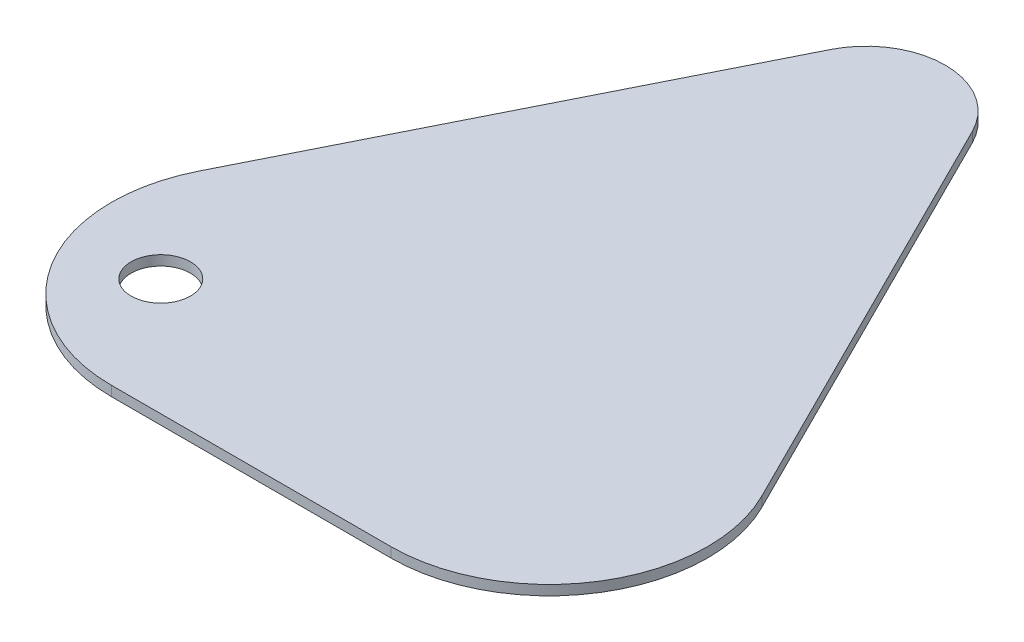
ISO-10303-21;
HEADER;
FILE_DESCRIPTION(('STEP AP214'),'2;1');
FILE_NAME('part.step','',(''),(''),'','','');
FILE_SCHEMA(('AUTOMOTIVE_DESIGN { 1 0 10303 214 1 1 1 1 }'));
ENDSEC;
DATA;
#1=APPLICATION_CONTEXT('core data for automotive mechanical design processes');
#2=APPLICATION_PROTOCOL_DEFINITION('international standard','automotive_design',2000,#1);
#3=PRODUCT_CONTEXT('',#1,'mechanical');
#4=PRODUCT('Part','Part','',(#3));
#5=PRODUCT_RELATED_PRODUCT_CATEGORY('part','',(#4));
#6=PRODUCT_DEFINITION_FORMATION('','',#4);
#7=PRODUCT_DEFINITION_CONTEXT('part definition',#1,'design');
#8=PRODUCT_DEFINITION('design','',#6,#7);
#9=PRODUCT_DEFINITION_SHAPE('','',#8);
#10=(LENGTH_UNIT() NAMED_UNIT(*) SI_UNIT(.MILLI.,.METRE.));
#11=(NAMED_UNIT(*) PLANE_ANGLE_UNIT() SI_UNIT($,.RADIAN.));
#12=(NAMED_UNIT(*) SI_UNIT($,.STERADIAN.) SOLID_ANGLE_UNIT());
#13=UNCERTAINTY_MEASURE_WITH_UNIT(LENGTH_MEASURE(1.E-05),#10,'distance_accuracy_value','');
#14=(GEOMETRIC_REPRESENTATION_CONTEXT(3) GLOBAL_UNCERTAINTY_ASSIGNED_CONTEXT((#13)) GLOBAL_UNIT_ASSIGNED_CONTEXT((#10,
#11,#12)) REPRESENTATION_CONTEXT('',''));
#15=CARTESIAN_POINT('',(0.,0.,0.));
#16=DIRECTION('',(0.,0.,1.));
#17=DIRECTION('',(1.,0.,0.));
#18=AXIS2_PLACEMENT_3D('',#15,#16,#17);
#19=CARTESIAN_POINT('',(-7.05572809000084,0.25,-8.));
#20=DIRECTION('',(0.,-1.,0.));
#21=DIRECTION('',(0.,0.,-1.));
#22=AXIS2_PLACEMENT_3D('',#19,#20,#21);
#23=PLANE('',#22);
#24=DIRECTION('',(1.,0.,0.));
#25=VECTOR('',#24,1.);
#26=CARTESIAN_POINT('',(0.,0.25,0.));
#27=LINE('',#26,#25);
#28=CARTESIAN_POINT('',(-7.05572809000074,0.25,0.));
#29=VERTEX_POINT('',#28);
#30=CARTESIAN_POINT('',(7.05572809000074,0.25,0.));
#31=VERTEX_POINT('',#30);
#32=EDGE_CURVE('E96',#29,#31,#27,.T.);
#33=ORIENTED_EDGE('',*,*,#32,.T.);
#34=CARTESIAN_POINT('',(7.05572809000084,0.25,-8.));
#35=DIRECTION('',(0.,1.,0.));
#36=DIRECTION('',(0.,0.,1.));
#37=AXIS2_PLACEMENT_3D('',#34,#35,#36);
#38=CIRCLE('',#37,8.);
#39=CARTESIAN_POINT('',(14.2111456180001,0.25,-11.5777087639998));
#40=VERTEX_POINT('',#39);
#41=EDGE_CURVE('E153',#31,#40,#38,.T.);
#42=ORIENTED_EDGE('',*,*,#41,.T.);
#43=DIRECTION('',(-0.447213595499958,0.,-0.894427190999916));
#44=VECTOR('',#43,1.);
#45=CARTESIAN_POINT('',(14.2111456180001,0.25,-11.5777087639998));
#46=LINE('',#45,#44);
#47=CARTESIAN_POINT('',(3.57770876399969,0.25,-32.8445824720006));
#48=VERTEX_POINT('',#47);
#49=EDGE_CURVE('E110',#40,#48,#46,.T.);
#50=ORIENTED_EDGE('',*,*,#49,.T.);
#51=CARTESIAN_POINT('',(0.,0.25,-31.0557280900008));
#52=DIRECTION('',(0.,1.,0.));
#53=DIRECTION('',(0.,0.,1.));
#54=AXIS2_PLACEMENT_3D('',#51,#52,#53);
#55=CIRCLE('',#54,4.);
#56=CARTESIAN_POINT('',(-3.57770876399969,0.25,-32.8445824720006));
#57=VERTEX_POINT('',#56);
#58=EDGE_CURVE('E104',#48,#57,#55,.T.);
#59=ORIENTED_EDGE('',*,*,#58,.T.);
#60=DIRECTION('',(-0.447213595499958,0.,0.894427190999916));
#61=VECTOR('',#60,1.);
#62=CARTESIAN_POINT('',(-14.2111456180001,0.25,-11.5777087639998));
#63=LINE('',#62,#61);
#64=CARTESIAN_POINT('',(-14.2111456180001,0.25,-11.5777087639998));
#65=VERTEX_POINT('',#64);
#66=EDGE_CURVE('E108',#57,#65,#63,.T.);
#67=ORIENTED_EDGE('',*,*,#66,.T.);
#68=CARTESIAN_POINT('',(-7.05572809000084,0.25,-8.));
#69=DIRECTION('',(0.,1.,0.));
#70=DIRECTION('',(0.,0.,-1.));
#71=AXIS2_PLACEMENT_3D('',#68,#69,#70);
#72=CIRCLE('',#71,8.);
#73=EDGE_CURVE('E60',#65,#29,#72,.T.);
#74=ORIENTED_EDGE('',*,*,#73,.T.);
#75=EDGE_LOOP('',(#33,#42,#50,#59,#67,#74));
#76=FACE_BOUND('',#75,.T.);
#77=CARTESIAN_POINT('',(-10.458331323409,0.25,-5.89707555152346));
#78=DIRECTION('',(0.,1.,0.));
#79=DIRECTION('',(0.,0.,1.));
#80=AXIS2_PLACEMENT_3D('',#77,#78,#79);
#81=CIRCLE('',#80,1.5);
#82=CARTESIAN_POINT('',(-10.458331323409,0.25,-4.39707555152346));
#83=VERTEX_POINT('',#82);
#84=EDGE_CURVE('E130',#83,#83,#81,.T.);
#85=ORIENTED_EDGE('',*,*,#84,.F.);
#86=EDGE_LOOP('',(#85));
#87=FACE_BOUND('',#86,.T.);
#88=ADVANCED_FACE('F43',(#76,#87),#23,.F.);
#89=CARTESIAN_POINT('',(-7.05572809000084,-0.25,-8.));
#90=DIRECTION('',(0.,-1.,0.));
#91=DIRECTION('',(0.,0.,-1.));
#92=AXIS2_PLACEMENT_3D('',#89,#90,#91);
#93=PLANE('',#92);
#94=DIRECTION('',(1.,0.,0.));
#95=VECTOR('',#94,1.);
#96=CARTESIAN_POINT('',(0.,-0.25,0.));
#97=LINE('',#96,#95);
#98=CARTESIAN_POINT('',(-7.05572809000074,-0.25,0.));
#99=VERTEX_POINT('',#98);
#100=CARTESIAN_POINT('',(7.05572809000074,-0.25,0.));
#101=VERTEX_POINT('',#100);
#102=EDGE_CURVE('E90',#99,#101,#97,.T.);
#103=ORIENTED_EDGE('',*,*,#102,.F.);
#104=CARTESIAN_POINT('',(-7.05572809000084,-0.25,-8.));
#105=DIRECTION('',(0.,1.,0.));
#106=DIRECTION('',(0.,0.,-1.));
#107=AXIS2_PLACEMENT_3D('',#104,#105,#106);
#108=CIRCLE('',#107,8.);
#109=CARTESIAN_POINT('',(-14.2111456180001,-0.25,-11.5777087639998));
#110=VERTEX_POINT('',#109);
#111=EDGE_CURVE('E136',#110,#99,#108,.T.);
#112=ORIENTED_EDGE('',*,*,#111,.F.);
#113=DIRECTION('',(-0.447213595499958,0.,0.894427190999916));
#114=VECTOR('',#113,1.);
#115=CARTESIAN_POINT('',(-14.2111456180001,-0.25,-11.5777087639998));
#116=LINE('',#115,#114);
#117=CARTESIAN_POINT('',(-3.57770876399969,-0.25,-32.8445824720006));
#118=VERTEX_POINT('',#117);
#119=EDGE_CURVE('E83',#118,#110,#116,.T.);
#120=ORIENTED_EDGE('',*,*,#119,.F.);
#121=CARTESIAN_POINT('',(0.,-0.25,-31.0557280900008));
#122=DIRECTION('',(0.,1.,0.));
#123=DIRECTION('',(0.,0.,1.));
#124=AXIS2_PLACEMENT_3D('',#121,#122,#123);
#125=CIRCLE('',#124,4.);
#126=CARTESIAN_POINT('',(3.57770876399969,-0.25,-32.8445824720006));
#127=VERTEX_POINT('',#126);
#128=EDGE_CURVE('E118',#127,#118,#125,.T.);
#129=ORIENTED_EDGE('',*,*,#128,.F.);
#130=DIRECTION('',(-0.447213595499958,0.,-0.894427190999916));
#131=VECTOR('',#130,1.);
#132=CARTESIAN_POINT('',(14.2111456180001,-0.25,-11.5777087639998));
#133=LINE('',#132,#131);
#134=CARTESIAN_POINT('',(14.2111456180001,-0.25,-11.5777087639998));
#135=VERTEX_POINT('',#134);
#136=EDGE_CURVE('E132',#135,#127,#133,.T.);
#137=ORIENTED_EDGE('',*,*,#136,.F.);
#138=CARTESIAN_POINT('',(7.05572809000084,-0.25,-8.));
#139=DIRECTION('',(0.,1.,0.));
#140=DIRECTION('',(0.,0.,1.));
#141=AXIS2_PLACEMENT_3D('',#138,#139,#140);
#142=CIRCLE('',#141,8.);
#143=EDGE_CURVE('E129',#101,#135,#142,.T.);
#144=ORIENTED_EDGE('',*,*,#143,.F.);
#145=EDGE_LOOP('',(#103,#112,#120,#129,#137,#144));
#146=FACE_BOUND('',#145,.T.);
#147=CARTESIAN_POINT('',(-10.458331323409,-0.25,-5.89707555152346));
#148=DIRECTION('',(0.,1.,0.));
#149=DIRECTION('',(0.,0.,1.));
#150=AXIS2_PLACEMENT_3D('',#147,#148,#149);
#151=CIRCLE('',#150,1.5);
#152=CARTESIAN_POINT('',(-10.458331323409,-0.25,-4.39707555152346));
#153=VERTEX_POINT('',#152);
#154=EDGE_CURVE('E157',#153,#153,#151,.T.);
#155=ORIENTED_EDGE('',*,*,#154,.T.);
#156=EDGE_LOOP('',(#155));
#157=FACE_BOUND('',#156,.T.);
#158=ADVANCED_FACE('F148',(#146,#157),#93,.T.);
#159=CARTESIAN_POINT('',(0.,0.25,0.));
#160=DIRECTION('',(0.,0.,-1.));
#161=DIRECTION('',(-1.,0.,0.));
#162=AXIS2_PLACEMENT_3D('',#159,#160,#161);
#163=PLANE('',#162);
#164=ORIENTED_EDGE('',*,*,#102,.T.);
#165=DIRECTION('',(0.,-1.,0.));
#166=VECTOR('',#165,1.);
#167=CARTESIAN_POINT('',(7.05572809000074,0.25,0.));
#168=LINE('',#167,#166);
#169=EDGE_CURVE('E13',#31,#101,#168,.T.);
#170=ORIENTED_EDGE('',*,*,#169,.F.);
#171=ORIENTED_EDGE('',*,*,#32,.F.);
#172=DIRECTION('',(0.,-1.,0.));
#173=VECTOR('',#172,1.);
#174=CARTESIAN_POINT('',(-7.05572809000074,0.25,0.));
#175=LINE('',#174,#173);
#176=EDGE_CURVE('E124',#29,#99,#175,.T.);
#177=ORIENTED_EDGE('',*,*,#176,.T.);
#178=EDGE_LOOP('',(#164,#170,#171,#177));
#179=FACE_BOUND('',#178,.T.);
#180=ADVANCED_FACE('F45',(#179),#163,.F.);
#181=CARTESIAN_POINT('',(7.05572809000084,0.25,-8.));
#182=DIRECTION('',(0.,-1.,0.));
#183=DIRECTION('',(0.,0.,-1.));
#184=AXIS2_PLACEMENT_3D('',#181,#182,#183);
#185=CYLINDRICAL_SURFACE('',#184,8.);
#186=ORIENTED_EDGE('',*,*,#143,.T.);
#187=DIRECTION('',(0.,-1.,0.));
#188=VECTOR('',#187,1.);
#189=CARTESIAN_POINT('',(14.2111456180001,0.25,-11.5777087639998));
#190=LINE('',#189,#188);
#191=EDGE_CURVE('E52',#40,#135,#190,.T.);
#192=ORIENTED_EDGE('',*,*,#191,.F.);
#193=ORIENTED_EDGE('',*,*,#41,.F.);
#194=ORIENTED_EDGE('',*,*,#169,.T.);
#195=EDGE_LOOP('',(#186,#192,#193,#194));
#196=FACE_BOUND('',#195,.T.);
#197=ADVANCED_FACE('F180',(#196),#185,.T.);
#198=CARTESIAN_POINT('',(14.2111456180001,0.25,-11.5777087639998));
#199=DIRECTION('',(-0.894427190999916,0.,0.447213595499958));
#200=DIRECTION('',(0.447213595499958,0.,0.894427190999916));
#201=AXIS2_PLACEMENT_3D('',#198,#199,#200);
#202=PLANE('',#201);
#203=ORIENTED_EDGE('',*,*,#136,.T.);
#204=DIRECTION('',(0.,-1.,0.));
#205=VECTOR('',#204,1.);
#206=CARTESIAN_POINT('',(3.57770876399969,0.25,-32.8445824720006));
#207=LINE('',#206,#205);
#208=EDGE_CURVE('E119',#48,#127,#207,.T.);
#209=ORIENTED_EDGE('',*,*,#208,.F.);
#210=ORIENTED_EDGE('',*,*,#49,.F.);
#211=ORIENTED_EDGE('',*,*,#191,.T.);
#212=EDGE_LOOP('',(#203,#209,#210,#211));
#213=FACE_BOUND('',#212,.T.);
#214=ADVANCED_FACE('F145',(#213),#202,.F.);
#215=CARTESIAN_POINT('',(0.,0.25,-31.0557280900008));
#216=DIRECTION('',(0.,-1.,0.));
#217=DIRECTION('',(0.,0.,-1.));
#218=AXIS2_PLACEMENT_3D('',#215,#216,#217);
#219=CYLINDRICAL_SURFACE('',#218,4.);
#220=ORIENTED_EDGE('',*,*,#128,.T.);
#221=DIRECTION('',(0.,-1.,0.));
#222=VECTOR('',#221,1.);
#223=CARTESIAN_POINT('',(-3.57770876399969,0.25,-32.8445824720006));
#224=LINE('',#223,#222);
#225=EDGE_CURVE('E115',#57,#118,#224,.T.);
#226=ORIENTED_EDGE('',*,*,#225,.F.);
#227=ORIENTED_EDGE('',*,*,#58,.F.);
#228=ORIENTED_EDGE('',*,*,#208,.T.);
#229=EDGE_LOOP('',(#220,#226,#227,#228));
#230=FACE_BOUND('',#229,.T.);
#231=ADVANCED_FACE('F116',(#230),#219,.T.);
#232=CARTESIAN_POINT('',(-14.2111456180001,0.25,-11.5777087639998));
#233=DIRECTION('',(0.894427190999916,0.,0.447213595499958));
#234=DIRECTION('',(0.447213595499958,0.,-0.894427190999916));
#235=AXIS2_PLACEMENT_3D('',#232,#233,#234);
#236=PLANE('',#235);
#237=ORIENTED_EDGE('',*,*,#119,.T.);
#238=DIRECTION('',(0.,-1.,0.));
#239=VECTOR('',#238,1.);
#240=CARTESIAN_POINT('',(-14.2111456180001,0.25,-11.5777087639998));
#241=LINE('',#240,#239);
#242=EDGE_CURVE('E120',#65,#110,#241,.T.);
#243=ORIENTED_EDGE('',*,*,#242,.F.);
#244=ORIENTED_EDGE('',*,*,#66,.F.);
#245=ORIENTED_EDGE('',*,*,#225,.T.);
#246=EDGE_LOOP('',(#237,#243,#244,#245));
#247=FACE_BOUND('',#246,.T.);
#248=ADVANCED_FACE('F122',(#247),#236,.F.);
#249=CARTESIAN_POINT('',(-7.05572809000084,0.25,-8.));
#250=DIRECTION('',(0.,-1.,0.));
#251=DIRECTION('',(0.,0.,-1.));
#252=AXIS2_PLACEMENT_3D('',#249,#250,#251);
#253=CYLINDRICAL_SURFACE('',#252,8.);
#254=ORIENTED_EDGE('',*,*,#111,.T.);
#255=ORIENTED_EDGE('',*,*,#176,.F.);
#256=ORIENTED_EDGE('',*,*,#73,.F.);
#257=ORIENTED_EDGE('',*,*,#242,.T.);
#258=EDGE_LOOP('',(#254,#255,#256,#257));
#259=FACE_BOUND('',#258,.T.);
#260=ADVANCED_FACE('F151',(#259),#253,.T.);
#261=CARTESIAN_POINT('',(-10.458331323409,0.25,-5.89707555152346));
#262=DIRECTION('',(0.,-1.,0.));
#263=DIRECTION('',(0.,0.,-1.));
#264=AXIS2_PLACEMENT_3D('',#261,#262,#263);
#265=CYLINDRICAL_SURFACE('',#264,1.5);
#266=ORIENTED_EDGE('',*,*,#84,.T.);
#267=EDGE_LOOP('',(#266));
#268=FACE_BOUND('',#267,.T.);
#269=ORIENTED_EDGE('',*,*,#154,.F.);
#270=EDGE_LOOP('',(#269));
#271=FACE_BOUND('',#270,.T.);
#272=ADVANCED_FACE('F163',(#268,#271),#265,.F.);
#273=CLOSED_SHELL('',(#88,#158,#180,#197,#214,#231,#248,#260,#272));
#274=MANIFOLD_SOLID_BREP('B2',#273);
#275=ADVANCED_BREP_SHAPE_REPRESENTATION('',(#18,#274),#14);
#276=SHAPE_DEFINITION_REPRESENTATION(#9,#275);
ENDSEC;
END-ISO-10303-21;
